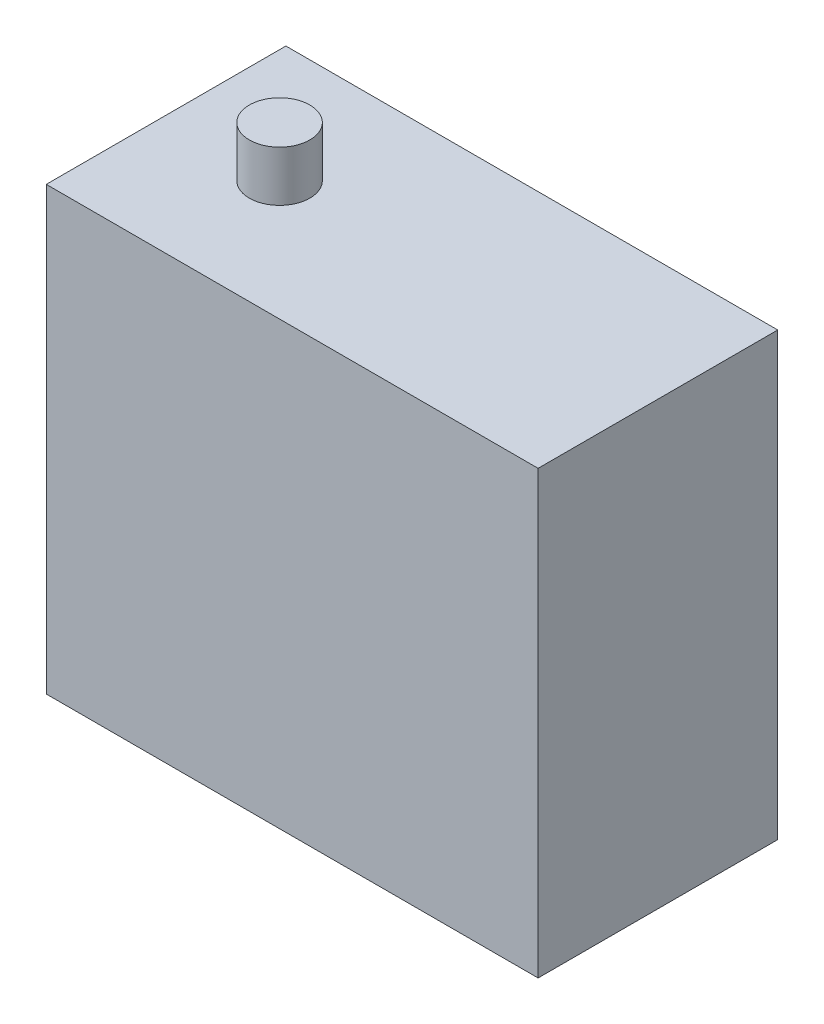
ISO-10303-21;
HEADER;
FILE_DESCRIPTION(('STEP AP214'),'2;1');
FILE_NAME('part.step','',(''),(''),'','','');
FILE_SCHEMA(('AUTOMOTIVE_DESIGN { 1 0 10303 214 1 1 1 1 }'));
ENDSEC;
DATA;
#1=APPLICATION_CONTEXT('core data for automotive mechanical design processes');
#2=APPLICATION_PROTOCOL_DEFINITION('international standard','automotive_design',2000,#1);
#3=PRODUCT_CONTEXT('',#1,'mechanical');
#4=PRODUCT('Part','Part','',(#3));
#5=PRODUCT_RELATED_PRODUCT_CATEGORY('part','',(#4));
#6=PRODUCT_DEFINITION_FORMATION('','',#4);
#7=PRODUCT_DEFINITION_CONTEXT('part definition',#1,'design');
#8=PRODUCT_DEFINITION('design','',#6,#7);
#9=PRODUCT_DEFINITION_SHAPE('','',#8);
#10=(LENGTH_UNIT() NAMED_UNIT(*) SI_UNIT(.MILLI.,.METRE.));
#11=(NAMED_UNIT(*) PLANE_ANGLE_UNIT() SI_UNIT($,.RADIAN.));
#12=(NAMED_UNIT(*) SI_UNIT($,.STERADIAN.) SOLID_ANGLE_UNIT());
#13=UNCERTAINTY_MEASURE_WITH_UNIT(LENGTH_MEASURE(1.E-05),#10,'distance_accuracy_value','');
#14=(GEOMETRIC_REPRESENTATION_CONTEXT(3) GLOBAL_UNCERTAINTY_ASSIGNED_CONTEXT((#13)) GLOBAL_UNIT_ASSIGNED_CONTEXT((#10,
#11,#12)) REPRESENTATION_CONTEXT('',''));
#15=CARTESIAN_POINT('',(0.,0.,0.));
#16=DIRECTION('',(0.,0.,1.));
#17=DIRECTION('',(1.,0.,0.));
#18=AXIS2_PLACEMENT_3D('',#15,#16,#17);
#19=CARTESIAN_POINT('',(-19.5,35.,9.50000000000001));
#20=DIRECTION('',(1.,0.,0.));
#21=DIRECTION('',(0.,0.,-1.));
#22=AXIS2_PLACEMENT_3D('',#19,#20,#21);
#23=PLANE('',#22);
#24=DIRECTION('',(0.,0.,1.));
#25=VECTOR('',#24,1.);
#26=CARTESIAN_POINT('',(-19.5,0.,9.50000000000001));
#27=LINE('',#26,#25);
#28=CARTESIAN_POINT('',(-19.5,0.,-9.49999999999999));
#29=VERTEX_POINT('',#28);
#30=CARTESIAN_POINT('',(-19.5,0.,9.50000000000001));
#31=VERTEX_POINT('',#30);
#32=EDGE_CURVE('E99',#29,#31,#27,.T.);
#33=ORIENTED_EDGE('',*,*,#32,.T.);
#34=DIRECTION('',(0.,-1.,0.));
#35=VECTOR('',#34,1.);
#36=CARTESIAN_POINT('',(-19.5,35.,9.50000000000001));
#37=LINE('',#36,#35);
#38=CARTESIAN_POINT('',(-19.5,35.,9.50000000000001));
#39=VERTEX_POINT('',#38);
#40=EDGE_CURVE('E11',#39,#31,#37,.T.);
#41=ORIENTED_EDGE('',*,*,#40,.F.);
#42=DIRECTION('',(0.,0.,1.));
#43=VECTOR('',#42,1.);
#44=CARTESIAN_POINT('',(-19.5,35.,9.50000000000001));
#45=LINE('',#44,#43);
#46=CARTESIAN_POINT('',(-19.5,35.,-9.49999999999999));
#47=VERTEX_POINT('',#46);
#48=EDGE_CURVE('E87',#47,#39,#45,.T.);
#49=ORIENTED_EDGE('',*,*,#48,.F.);
#50=DIRECTION('',(0.,-1.,0.));
#51=VECTOR('',#50,1.);
#52=CARTESIAN_POINT('',(-19.5,35.,-9.49999999999999));
#53=LINE('',#52,#51);
#54=EDGE_CURVE('E95',#47,#29,#53,.T.);
#55=ORIENTED_EDGE('',*,*,#54,.T.);
#56=EDGE_LOOP('',(#33,#41,#49,#55));
#57=FACE_BOUND('',#56,.T.);
#58=ADVANCED_FACE('F36',(#57),#23,.F.);
#59=CARTESIAN_POINT('',(19.5,35.,9.5));
#60=DIRECTION('',(0.,0.,-1.));
#61=DIRECTION('',(-1.,0.,0.));
#62=AXIS2_PLACEMENT_3D('',#59,#60,#61);
#63=PLANE('',#62);
#64=DIRECTION('',(1.,0.,0.));
#65=VECTOR('',#64,1.);
#66=CARTESIAN_POINT('',(19.5,0.,9.5));
#67=LINE('',#66,#65);
#68=CARTESIAN_POINT('',(19.5,0.,9.5));
#69=VERTEX_POINT('',#68);
#70=EDGE_CURVE('E91',#31,#69,#67,.T.);
#71=ORIENTED_EDGE('',*,*,#70,.T.);
#72=DIRECTION('',(0.,-1.,0.));
#73=VECTOR('',#72,1.);
#74=CARTESIAN_POINT('',(19.5,35.,9.5));
#75=LINE('',#74,#73);
#76=CARTESIAN_POINT('',(19.5,35.,9.5));
#77=VERTEX_POINT('',#76);
#78=EDGE_CURVE('E44',#77,#69,#75,.T.);
#79=ORIENTED_EDGE('',*,*,#78,.F.);
#80=DIRECTION('',(1.,0.,0.));
#81=VECTOR('',#80,1.);
#82=CARTESIAN_POINT('',(19.5,35.,9.5));
#83=LINE('',#82,#81);
#84=EDGE_CURVE('E82',#39,#77,#83,.T.);
#85=ORIENTED_EDGE('',*,*,#84,.F.);
#86=ORIENTED_EDGE('',*,*,#40,.T.);
#87=EDGE_LOOP('',(#71,#79,#85,#86));
#88=FACE_BOUND('',#87,.T.);
#89=ADVANCED_FACE('F90',(#88),#63,.F.);
#90=CARTESIAN_POINT('',(19.5,35.,9.5));
#91=DIRECTION('',(-1.,0.,0.));
#92=DIRECTION('',(0.,0.,1.));
#93=AXIS2_PLACEMENT_3D('',#90,#91,#92);
#94=PLANE('',#93);
#95=DIRECTION('',(0.,0.,-1.));
#96=VECTOR('',#95,1.);
#97=CARTESIAN_POINT('',(19.5,0.,9.5));
#98=LINE('',#97,#96);
#99=CARTESIAN_POINT('',(19.5,0.,-9.5));
#100=VERTEX_POINT('',#99);
#101=EDGE_CURVE('E69',#69,#100,#98,.T.);
#102=ORIENTED_EDGE('',*,*,#101,.T.);
#103=DIRECTION('',(0.,-1.,0.));
#104=VECTOR('',#103,1.);
#105=CARTESIAN_POINT('',(19.5,35.,-9.5));
#106=LINE('',#105,#104);
#107=CARTESIAN_POINT('',(19.5,35.,-9.5));
#108=VERTEX_POINT('',#107);
#109=EDGE_CURVE('E92',#108,#100,#106,.T.);
#110=ORIENTED_EDGE('',*,*,#109,.F.);
#111=DIRECTION('',(0.,0.,-1.));
#112=VECTOR('',#111,1.);
#113=CARTESIAN_POINT('',(19.5,35.,9.5));
#114=LINE('',#113,#112);
#115=EDGE_CURVE('E85',#77,#108,#114,.T.);
#116=ORIENTED_EDGE('',*,*,#115,.F.);
#117=ORIENTED_EDGE('',*,*,#78,.T.);
#118=EDGE_LOOP('',(#102,#110,#116,#117));
#119=FACE_BOUND('',#118,.T.);
#120=ADVANCED_FACE('F93',(#119),#94,.F.);
#121=CARTESIAN_POINT('',(19.5,35.,-9.5));
#122=DIRECTION('',(0.,0.,1.));
#123=DIRECTION('',(1.,0.,0.));
#124=AXIS2_PLACEMENT_3D('',#121,#122,#123);
#125=PLANE('',#124);
#126=DIRECTION('',(-1.,0.,0.));
#127=VECTOR('',#126,1.);
#128=CARTESIAN_POINT('',(19.5,0.,-9.5));
#129=LINE('',#128,#127);
#130=EDGE_CURVE('E75',#100,#29,#129,.T.);
#131=ORIENTED_EDGE('',*,*,#130,.T.);
#132=ORIENTED_EDGE('',*,*,#54,.F.);
#133=DIRECTION('',(-1.,0.,0.));
#134=VECTOR('',#133,1.);
#135=CARTESIAN_POINT('',(19.5,35.,-9.5));
#136=LINE('',#135,#134);
#137=EDGE_CURVE('E52',#108,#47,#136,.T.);
#138=ORIENTED_EDGE('',*,*,#137,.F.);
#139=ORIENTED_EDGE('',*,*,#109,.T.);
#140=EDGE_LOOP('',(#131,#132,#138,#139));
#141=FACE_BOUND('',#140,.T.);
#142=ADVANCED_FACE('F107',(#141),#125,.F.);
#143=CARTESIAN_POINT('',(0.,35.,0.));
#144=DIRECTION('',(0.,1.,0.));
#145=DIRECTION('',(0.,0.,1.));
#146=AXIS2_PLACEMENT_3D('',#143,#144,#145);
#147=PLANE('',#146);
#148=CARTESIAN_POINT('',(-10.5,35.,0.));
#149=DIRECTION('',(0.,1.,0.));
#150=DIRECTION('',(0.,0.,1.));
#151=AXIS2_PLACEMENT_3D('',#148,#149,#150);
#152=CIRCLE('',#151,2.4);
#153=CARTESIAN_POINT('',(-10.5,35.,2.4));
#154=VERTEX_POINT('',#153);
#155=EDGE_CURVE('E113',#154,#154,#152,.T.);
#156=ORIENTED_EDGE('',*,*,#155,.F.);
#157=EDGE_LOOP('',(#156));
#158=FACE_BOUND('',#157,.T.);
#159=ORIENTED_EDGE('',*,*,#48,.T.);
#160=ORIENTED_EDGE('',*,*,#84,.T.);
#161=ORIENTED_EDGE('',*,*,#115,.T.);
#162=ORIENTED_EDGE('',*,*,#137,.T.);
#163=EDGE_LOOP('',(#159,#160,#161,#162));
#164=FACE_BOUND('',#163,.T.);
#165=ADVANCED_FACE('F83',(#158,#164),#147,.T.);
#166=CARTESIAN_POINT('',(0.,0.,0.));
#167=DIRECTION('',(0.,1.,0.));
#168=DIRECTION('',(0.,0.,1.));
#169=AXIS2_PLACEMENT_3D('',#166,#167,#168);
#170=PLANE('',#169);
#171=ORIENTED_EDGE('',*,*,#32,.F.);
#172=ORIENTED_EDGE('',*,*,#130,.F.);
#173=ORIENTED_EDGE('',*,*,#101,.F.);
#174=ORIENTED_EDGE('',*,*,#70,.F.);
#175=EDGE_LOOP('',(#171,#172,#173,#174));
#176=FACE_BOUND('',#175,.T.);
#177=ADVANCED_FACE('F110',(#176),#170,.F.);
#178=CARTESIAN_POINT('',(-10.5,39.,0.));
#179=DIRECTION('',(0.,-1.,0.));
#180=DIRECTION('',(0.,0.,-1.));
#181=AXIS2_PLACEMENT_3D('',#178,#179,#180);
#182=CYLINDRICAL_SURFACE('',#181,2.4);
#183=CARTESIAN_POINT('',(-10.5,39.,0.));
#184=DIRECTION('',(0.,1.,0.));
#185=DIRECTION('',(0.,0.,1.));
#186=AXIS2_PLACEMENT_3D('',#183,#184,#185);
#187=CIRCLE('',#186,2.4);
#188=CARTESIAN_POINT('',(-10.5,39.,2.4));
#189=VERTEX_POINT('',#188);
#190=EDGE_CURVE('E102',#189,#189,#187,.T.);
#191=ORIENTED_EDGE('',*,*,#190,.F.);
#192=EDGE_LOOP('',(#191));
#193=FACE_BOUND('',#192,.T.);
#194=ORIENTED_EDGE('',*,*,#155,.T.);
#195=EDGE_LOOP('',(#194));
#196=FACE_BOUND('',#195,.T.);
#197=ADVANCED_FACE('F121',(#193,#196),#182,.T.);
#198=CARTESIAN_POINT('',(-10.5,39.,0.));
#199=DIRECTION('',(0.,1.,0.));
#200=DIRECTION('',(0.,0.,1.));
#201=AXIS2_PLACEMENT_3D('',#198,#199,#200);
#202=PLANE('',#201);
#203=ORIENTED_EDGE('',*,*,#190,.T.);
#204=EDGE_LOOP('',(#203));
#205=FACE_BOUND('',#204,.T.);
#206=ADVANCED_FACE('F119',(#205),#202,.T.);
#207=CLOSED_SHELL('',(#58,#89,#120,#142,#165,#177,#197,#206));
#208=MANIFOLD_SOLID_BREP('B2',#207);
#209=ADVANCED_BREP_SHAPE_REPRESENTATION('',(#18,#208),#14);
#210=SHAPE_DEFINITION_REPRESENTATION(#9,#209);
ENDSEC;
END-ISO-10303-21;
